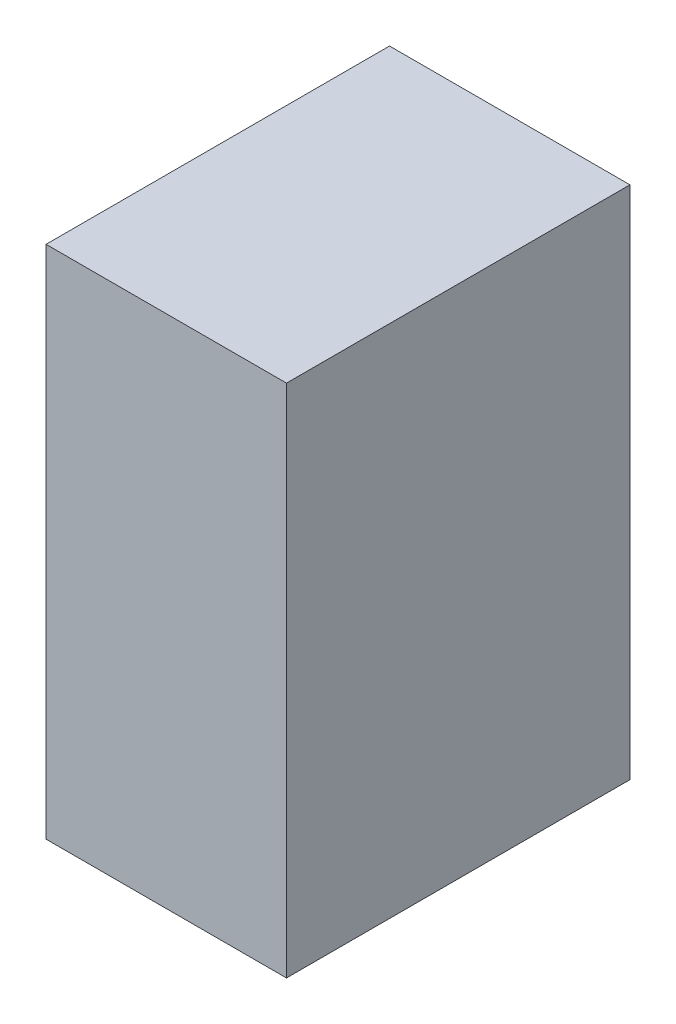
ISO-10303-21;
HEADER;
FILE_DESCRIPTION(('STEP AP214'),'2;1');
FILE_NAME('part.step','',(''),(''),'','','');
FILE_SCHEMA(('AUTOMOTIVE_DESIGN { 1 0 10303 214 1 1 1 1 }'));
ENDSEC;
DATA;
#1=APPLICATION_CONTEXT('core data for automotive mechanical design processes');
#2=APPLICATION_PROTOCOL_DEFINITION('international standard','automotive_design',2000,#1);
#3=PRODUCT_CONTEXT('',#1,'mechanical');
#4=PRODUCT('Part','Part','',(#3));
#5=PRODUCT_RELATED_PRODUCT_CATEGORY('part','',(#4));
#6=PRODUCT_DEFINITION_FORMATION('','',#4);
#7=PRODUCT_DEFINITION_CONTEXT('part definition',#1,'design');
#8=PRODUCT_DEFINITION('design','',#6,#7);
#9=PRODUCT_DEFINITION_SHAPE('','',#8);
#10=(LENGTH_UNIT() NAMED_UNIT(*) SI_UNIT(.MILLI.,.METRE.));
#11=(NAMED_UNIT(*) PLANE_ANGLE_UNIT() SI_UNIT($,.RADIAN.));
#12=(NAMED_UNIT(*) SI_UNIT($,.STERADIAN.) SOLID_ANGLE_UNIT());
#13=UNCERTAINTY_MEASURE_WITH_UNIT(LENGTH_MEASURE(1.E-05),#10,'distance_accuracy_value','');
#14=(GEOMETRIC_REPRESENTATION_CONTEXT(3) GLOBAL_UNCERTAINTY_ASSIGNED_CONTEXT((#13)) GLOBAL_UNIT_ASSIGNED_CONTEXT((#10,
#11,#12)) REPRESENTATION_CONTEXT('',''));
#15=CARTESIAN_POINT('',(0.,0.,0.));
#16=DIRECTION('',(0.,0.,1.));
#17=DIRECTION('',(1.,0.,0.));
#18=AXIS2_PLACEMENT_3D('',#15,#16,#17);
#19=CARTESIAN_POINT('',(17.78,38.1,-25.4));
#20=DIRECTION('',(-1.,0.,0.));
#21=DIRECTION('',(0.,0.,1.));
#22=AXIS2_PLACEMENT_3D('',#19,#20,#21);
#23=PLANE('',#22);
#24=DIRECTION('',(0.,0.,-1.));
#25=VECTOR('',#24,1.);
#26=CARTESIAN_POINT('',(17.78,-38.1,-25.4));
#27=LINE('',#26,#25);
#28=CARTESIAN_POINT('',(17.78,-38.1,25.4));
#29=VERTEX_POINT('',#28);
#30=CARTESIAN_POINT('',(17.78,-38.1,-25.4));
#31=VERTEX_POINT('',#30);
#32=EDGE_CURVE('E101',#29,#31,#27,.T.);
#33=ORIENTED_EDGE('',*,*,#32,.T.);
#34=DIRECTION('',(0.,-1.,0.));
#35=VECTOR('',#34,1.);
#36=CARTESIAN_POINT('',(17.78,38.1,-25.4));
#37=LINE('',#36,#35);
#38=CARTESIAN_POINT('',(17.78,38.1,-25.4));
#39=VERTEX_POINT('',#38);
#40=EDGE_CURVE('E11',#39,#31,#37,.T.);
#41=ORIENTED_EDGE('',*,*,#40,.F.);
#42=DIRECTION('',(0.,0.,-1.));
#43=VECTOR('',#42,1.);
#44=CARTESIAN_POINT('',(17.78,38.1,-25.4));
#45=LINE('',#44,#43);
#46=CARTESIAN_POINT('',(17.78,38.1,25.4));
#47=VERTEX_POINT('',#46);
#48=EDGE_CURVE('E89',#47,#39,#45,.T.);
#49=ORIENTED_EDGE('',*,*,#48,.F.);
#50=DIRECTION('',(0.,-1.,0.));
#51=VECTOR('',#50,1.);
#52=CARTESIAN_POINT('',(17.78,38.1,25.4));
#53=LINE('',#52,#51);
#54=EDGE_CURVE('E97',#47,#29,#53,.T.);
#55=ORIENTED_EDGE('',*,*,#54,.T.);
#56=EDGE_LOOP('',(#33,#41,#49,#55));
#57=FACE_BOUND('',#56,.T.);
#58=ADVANCED_FACE('F38',(#57),#23,.F.);
#59=CARTESIAN_POINT('',(-17.78,38.1,-25.4));
#60=DIRECTION('',(0.,0.,1.));
#61=DIRECTION('',(1.,0.,0.));
#62=AXIS2_PLACEMENT_3D('',#59,#60,#61);
#63=PLANE('',#62);
#64=DIRECTION('',(-1.,0.,0.));
#65=VECTOR('',#64,1.);
#66=CARTESIAN_POINT('',(-17.78,-38.1,-25.4));
#67=LINE('',#66,#65);
#68=CARTESIAN_POINT('',(-17.78,-38.1,-25.4));
#69=VERTEX_POINT('',#68);
#70=EDGE_CURVE('E93',#31,#69,#67,.T.);
#71=ORIENTED_EDGE('',*,*,#70,.T.);
#72=DIRECTION('',(0.,-1.,0.));
#73=VECTOR('',#72,1.);
#74=CARTESIAN_POINT('',(-17.78,38.1,-25.4));
#75=LINE('',#74,#73);
#76=CARTESIAN_POINT('',(-17.78,38.1,-25.4));
#77=VERTEX_POINT('',#76);
#78=EDGE_CURVE('E46',#77,#69,#75,.T.);
#79=ORIENTED_EDGE('',*,*,#78,.F.);
#80=DIRECTION('',(-1.,0.,0.));
#81=VECTOR('',#80,1.);
#82=CARTESIAN_POINT('',(-17.78,38.1,-25.4));
#83=LINE('',#82,#81);
#84=EDGE_CURVE('E84',#39,#77,#83,.T.);
#85=ORIENTED_EDGE('',*,*,#84,.F.);
#86=ORIENTED_EDGE('',*,*,#40,.T.);
#87=EDGE_LOOP('',(#71,#79,#85,#86));
#88=FACE_BOUND('',#87,.T.);
#89=ADVANCED_FACE('F92',(#88),#63,.F.);
#90=CARTESIAN_POINT('',(-17.78,38.1,-25.4));
#91=DIRECTION('',(1.,0.,0.));
#92=DIRECTION('',(0.,0.,-1.));
#93=AXIS2_PLACEMENT_3D('',#90,#91,#92);
#94=PLANE('',#93);
#95=DIRECTION('',(0.,0.,1.));
#96=VECTOR('',#95,1.);
#97=CARTESIAN_POINT('',(-17.78,-38.1,-25.4));
#98=LINE('',#97,#96);
#99=CARTESIAN_POINT('',(-17.78,-38.1,25.4));
#100=VERTEX_POINT('',#99);
#101=EDGE_CURVE('E71',#69,#100,#98,.T.);
#102=ORIENTED_EDGE('',*,*,#101,.T.);
#103=DIRECTION('',(0.,-1.,0.));
#104=VECTOR('',#103,1.);
#105=CARTESIAN_POINT('',(-17.78,38.1,25.4));
#106=LINE('',#105,#104);
#107=CARTESIAN_POINT('',(-17.78,38.1,25.4));
#108=VERTEX_POINT('',#107);
#109=EDGE_CURVE('E94',#108,#100,#106,.T.);
#110=ORIENTED_EDGE('',*,*,#109,.F.);
#111=DIRECTION('',(0.,0.,1.));
#112=VECTOR('',#111,1.);
#113=CARTESIAN_POINT('',(-17.78,38.1,-25.4));
#114=LINE('',#113,#112);
#115=EDGE_CURVE('E87',#77,#108,#114,.T.);
#116=ORIENTED_EDGE('',*,*,#115,.F.);
#117=ORIENTED_EDGE('',*,*,#78,.T.);
#118=EDGE_LOOP('',(#102,#110,#116,#117));
#119=FACE_BOUND('',#118,.T.);
#120=ADVANCED_FACE('F95',(#119),#94,.F.);
#121=CARTESIAN_POINT('',(-17.78,38.1,25.4));
#122=DIRECTION('',(0.,0.,-1.));
#123=DIRECTION('',(-1.,0.,0.));
#124=AXIS2_PLACEMENT_3D('',#121,#122,#123);
#125=PLANE('',#124);
#126=DIRECTION('',(1.,0.,0.));
#127=VECTOR('',#126,1.);
#128=CARTESIAN_POINT('',(-17.78,-38.1,25.4));
#129=LINE('',#128,#127);
#130=EDGE_CURVE('E77',#100,#29,#129,.T.);
#131=ORIENTED_EDGE('',*,*,#130,.T.);
#132=ORIENTED_EDGE('',*,*,#54,.F.);
#133=DIRECTION('',(1.,0.,0.));
#134=VECTOR('',#133,1.);
#135=CARTESIAN_POINT('',(-17.78,38.1,25.4));
#136=LINE('',#135,#134);
#137=EDGE_CURVE('E54',#108,#47,#136,.T.);
#138=ORIENTED_EDGE('',*,*,#137,.F.);
#139=ORIENTED_EDGE('',*,*,#109,.T.);
#140=EDGE_LOOP('',(#131,#132,#138,#139));
#141=FACE_BOUND('',#140,.T.);
#142=ADVANCED_FACE('F108',(#141),#125,.F.);
#143=CARTESIAN_POINT('',(0.,38.1,0.));
#144=DIRECTION('',(0.,1.,0.));
#145=DIRECTION('',(0.,0.,1.));
#146=AXIS2_PLACEMENT_3D('',#143,#144,#145);
#147=PLANE('',#146);
#148=ORIENTED_EDGE('',*,*,#48,.T.);
#149=ORIENTED_EDGE('',*,*,#84,.T.);
#150=ORIENTED_EDGE('',*,*,#115,.T.);
#151=ORIENTED_EDGE('',*,*,#137,.T.);
#152=EDGE_LOOP('',(#148,#149,#150,#151));
#153=FACE_BOUND('',#152,.T.);
#154=ADVANCED_FACE('F85',(#153),#147,.T.);
#155=CARTESIAN_POINT('',(0.,-38.1,0.));
#156=DIRECTION('',(0.,1.,0.));
#157=DIRECTION('',(0.,0.,1.));
#158=AXIS2_PLACEMENT_3D('',#155,#156,#157);
#159=PLANE('',#158);
#160=ORIENTED_EDGE('',*,*,#32,.F.);
#161=ORIENTED_EDGE('',*,*,#130,.F.);
#162=ORIENTED_EDGE('',*,*,#101,.F.);
#163=ORIENTED_EDGE('',*,*,#70,.F.);
#164=EDGE_LOOP('',(#160,#161,#162,#163));
#165=FACE_BOUND('',#164,.T.);
#166=ADVANCED_FACE('F111',(#165),#159,.F.);
#167=CLOSED_SHELL('',(#58,#89,#120,#142,#154,#166));
#168=MANIFOLD_SOLID_BREP('B2',#167);
#169=ADVANCED_BREP_SHAPE_REPRESENTATION('',(#18,#168),#14);
#170=SHAPE_DEFINITION_REPRESENTATION(#9,#169);
ENDSEC;
END-ISO-10303-21;
